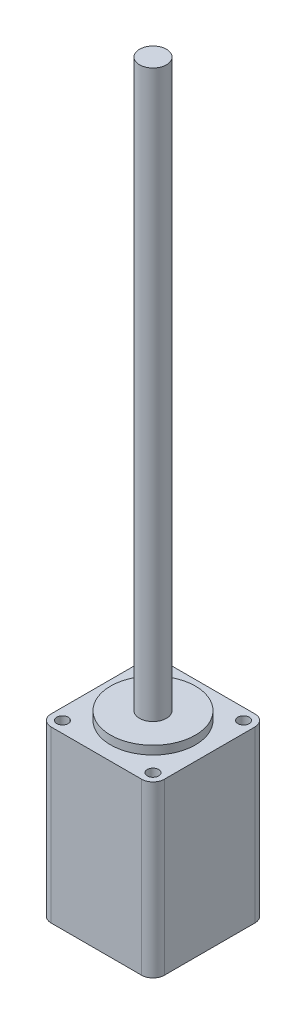
ISO-10303-21;
HEADER;
FILE_DESCRIPTION(('STEP AP214'),'2;1');
FILE_NAME('part.step','',(''),(''),'','','');
FILE_SCHEMA(('AUTOMOTIVE_DESIGN { 1 0 10303 214 1 1 1 1 }'));
ENDSEC;
DATA;
#1=APPLICATION_CONTEXT('core data for automotive mechanical design processes');
#2=APPLICATION_PROTOCOL_DEFINITION('international standard','automotive_design',2000,#1);
#3=PRODUCT_CONTEXT('',#1,'mechanical');
#4=PRODUCT('Part','Part','',(#3));
#5=PRODUCT_RELATED_PRODUCT_CATEGORY('part','',(#4));
#6=PRODUCT_DEFINITION_FORMATION('','',#4);
#7=PRODUCT_DEFINITION_CONTEXT('part definition',#1,'design');
#8=PRODUCT_DEFINITION('design','',#6,#7);
#9=PRODUCT_DEFINITION_SHAPE('','',#8);
#10=(LENGTH_UNIT() NAMED_UNIT(*) SI_UNIT(.MILLI.,.METRE.));
#11=(NAMED_UNIT(*) PLANE_ANGLE_UNIT() SI_UNIT($,.RADIAN.));
#12=(NAMED_UNIT(*) SI_UNIT($,.STERADIAN.) SOLID_ANGLE_UNIT());
#13=UNCERTAINTY_MEASURE_WITH_UNIT(LENGTH_MEASURE(1.E-05),#10,'distance_accuracy_value','');
#14=(GEOMETRIC_REPRESENTATION_CONTEXT(3) GLOBAL_UNCERTAINTY_ASSIGNED_CONTEXT((#13)) GLOBAL_UNIT_ASSIGNED_CONTEXT((#10,
#11,#12)) REPRESENTATION_CONTEXT('',''));
#15=CARTESIAN_POINT('',(0.,0.,0.));
#16=DIRECTION('',(0.,0.,1.));
#17=DIRECTION('',(1.,0.,0.));
#18=AXIS2_PLACEMENT_3D('',#15,#16,#17);
#19=CARTESIAN_POINT('',(10.,30.,10.));
#20=DIRECTION('',(-1.,0.,0.));
#21=DIRECTION('',(0.,0.,1.));
#22=AXIS2_PLACEMENT_3D('',#19,#20,#21);
#23=PLANE('',#22);
#24=DIRECTION('',(0.,0.,-1.));
#25=VECTOR('',#24,1.);
#26=CARTESIAN_POINT('',(10.,0.,10.));
#27=LINE('',#26,#25);
#28=CARTESIAN_POINT('',(10.,0.,8.));
#29=VERTEX_POINT('',#28);
#30=CARTESIAN_POINT('',(10.,0.,-8.));
#31=VERTEX_POINT('',#30);
#32=EDGE_CURVE('E130',#29,#31,#27,.T.);
#33=ORIENTED_EDGE('',*,*,#32,.T.);
#34=DIRECTION('',(0.,-1.,0.));
#35=VECTOR('',#34,1.);
#36=CARTESIAN_POINT('',(10.,30.,-8.));
#37=LINE('',#36,#35);
#38=CARTESIAN_POINT('',(10.,30.,-8.));
#39=VERTEX_POINT('',#38);
#40=EDGE_CURVE('E41',#31,#39,#37,.F.);
#41=ORIENTED_EDGE('',*,*,#40,.T.);
#42=DIRECTION('',(0.,0.,-1.));
#43=VECTOR('',#42,1.);
#44=CARTESIAN_POINT('',(10.,30.,10.));
#45=LINE('',#44,#43);
#46=CARTESIAN_POINT('',(10.,30.,8.));
#47=VERTEX_POINT('',#46);
#48=EDGE_CURVE('E128',#47,#39,#45,.T.);
#49=ORIENTED_EDGE('',*,*,#48,.F.);
#50=DIRECTION('',(0.,-1.,0.));
#51=VECTOR('',#50,1.);
#52=CARTESIAN_POINT('',(10.,30.,8.));
#53=LINE('',#52,#51);
#54=EDGE_CURVE('E154',#47,#29,#53,.T.);
#55=ORIENTED_EDGE('',*,*,#54,.T.);
#56=EDGE_LOOP('',(#33,#41,#49,#55));
#57=FACE_BOUND('',#56,.T.);
#58=ADVANCED_FACE('F33',(#57),#23,.F.);
#59=CARTESIAN_POINT('',(-10.,30.,-10.));
#60=DIRECTION('',(0.,0.,1.));
#61=DIRECTION('',(1.,0.,0.));
#62=AXIS2_PLACEMENT_3D('',#59,#60,#61);
#63=PLANE('',#62);
#64=DIRECTION('',(-1.,0.,0.));
#65=VECTOR('',#64,1.);
#66=CARTESIAN_POINT('',(-10.,0.,-10.));
#67=LINE('',#66,#65);
#68=CARTESIAN_POINT('',(8.,0.,-10.));
#69=VERTEX_POINT('',#68);
#70=CARTESIAN_POINT('',(-8.,0.,-10.));
#71=VERTEX_POINT('',#70);
#72=EDGE_CURVE('E126',#69,#71,#67,.T.);
#73=ORIENTED_EDGE('',*,*,#72,.T.);
#74=DIRECTION('',(0.,-1.,0.));
#75=VECTOR('',#74,1.);
#76=CARTESIAN_POINT('',(-8.,30.,-10.));
#77=LINE('',#76,#75);
#78=CARTESIAN_POINT('',(-8.,30.,-10.));
#79=VERTEX_POINT('',#78);
#80=EDGE_CURVE('E105',#71,#79,#77,.F.);
#81=ORIENTED_EDGE('',*,*,#80,.T.);
#82=DIRECTION('',(-1.,0.,0.));
#83=VECTOR('',#82,1.);
#84=CARTESIAN_POINT('',(-10.,30.,-10.));
#85=LINE('',#84,#83);
#86=CARTESIAN_POINT('',(8.,30.,-10.));
#87=VERTEX_POINT('',#86);
#88=EDGE_CURVE('E169',#87,#79,#85,.T.);
#89=ORIENTED_EDGE('',*,*,#88,.F.);
#90=DIRECTION('',(0.,-1.,0.));
#91=VECTOR('',#90,1.);
#92=CARTESIAN_POINT('',(8.,30.,-10.));
#93=LINE('',#92,#91);
#94=EDGE_CURVE('E110',#87,#69,#93,.T.);
#95=ORIENTED_EDGE('',*,*,#94,.T.);
#96=EDGE_LOOP('',(#73,#81,#89,#95));
#97=FACE_BOUND('',#96,.T.);
#98=ADVANCED_FACE('F174',(#97),#63,.F.);
#99=CARTESIAN_POINT('',(-10.,30.,10.));
#100=DIRECTION('',(1.,0.,0.));
#101=DIRECTION('',(0.,0.,-1.));
#102=AXIS2_PLACEMENT_3D('',#99,#100,#101);
#103=PLANE('',#102);
#104=DIRECTION('',(0.,0.,1.));
#105=VECTOR('',#104,1.);
#106=CARTESIAN_POINT('',(-10.,30.,10.));
#107=LINE('',#106,#105);
#108=CARTESIAN_POINT('',(-10.,30.,-8.));
#109=VERTEX_POINT('',#108);
#110=CARTESIAN_POINT('',(-10.,30.,8.));
#111=VERTEX_POINT('',#110);
#112=EDGE_CURVE('E119',#109,#111,#107,.T.);
#113=ORIENTED_EDGE('',*,*,#112,.F.);
#114=DIRECTION('',(0.,-1.,0.));
#115=VECTOR('',#114,1.);
#116=CARTESIAN_POINT('',(-10.,30.,-8.));
#117=LINE('',#116,#115);
#118=CARTESIAN_POINT('',(-10.,0.,-8.));
#119=VERTEX_POINT('',#118);
#120=EDGE_CURVE('E104',#109,#119,#117,.T.);
#121=ORIENTED_EDGE('',*,*,#120,.T.);
#122=DIRECTION('',(0.,0.,1.));
#123=VECTOR('',#122,1.);
#124=CARTESIAN_POINT('',(-10.,0.,10.));
#125=LINE('',#124,#123);
#126=CARTESIAN_POINT('',(-10.,0.,8.));
#127=VERTEX_POINT('',#126);
#128=EDGE_CURVE('E117',#119,#127,#125,.T.);
#129=ORIENTED_EDGE('',*,*,#128,.T.);
#130=DIRECTION('',(0.,-1.,0.));
#131=VECTOR('',#130,1.);
#132=CARTESIAN_POINT('',(-10.,30.,8.));
#133=LINE('',#132,#131);
#134=EDGE_CURVE('E121',#127,#111,#133,.F.);
#135=ORIENTED_EDGE('',*,*,#134,.T.);
#136=EDGE_LOOP('',(#113,#121,#129,#135));
#137=FACE_BOUND('',#136,.T.);
#138=ADVANCED_FACE('F116',(#137),#103,.F.);
#139=CARTESIAN_POINT('',(-10.,30.,10.));
#140=DIRECTION('',(0.,0.,-1.));
#141=DIRECTION('',(-1.,0.,0.));
#142=AXIS2_PLACEMENT_3D('',#139,#140,#141);
#143=PLANE('',#142);
#144=DIRECTION('',(1.,0.,0.));
#145=VECTOR('',#144,1.);
#146=CARTESIAN_POINT('',(-10.,30.,10.));
#147=LINE('',#146,#145);
#148=CARTESIAN_POINT('',(-8.,30.,10.));
#149=VERTEX_POINT('',#148);
#150=CARTESIAN_POINT('',(8.,30.,10.));
#151=VERTEX_POINT('',#150);
#152=EDGE_CURVE('E134',#149,#151,#147,.T.);
#153=ORIENTED_EDGE('',*,*,#152,.F.);
#154=DIRECTION('',(0.,-1.,0.));
#155=VECTOR('',#154,1.);
#156=CARTESIAN_POINT('',(-8.,30.,10.));
#157=LINE('',#156,#155);
#158=CARTESIAN_POINT('',(-8.,0.,10.));
#159=VERTEX_POINT('',#158);
#160=EDGE_CURVE('E151',#149,#159,#157,.T.);
#161=ORIENTED_EDGE('',*,*,#160,.T.);
#162=DIRECTION('',(1.,0.,0.));
#163=VECTOR('',#162,1.);
#164=CARTESIAN_POINT('',(-10.,0.,10.));
#165=LINE('',#164,#163);
#166=CARTESIAN_POINT('',(8.,0.,10.));
#167=VERTEX_POINT('',#166);
#168=EDGE_CURVE('E125',#159,#167,#165,.T.);
#169=ORIENTED_EDGE('',*,*,#168,.T.);
#170=DIRECTION('',(0.,-1.,0.));
#171=VECTOR('',#170,1.);
#172=CARTESIAN_POINT('',(8.,30.,10.));
#173=LINE('',#172,#171);
#174=EDGE_CURVE('E48',#167,#151,#173,.F.);
#175=ORIENTED_EDGE('',*,*,#174,.T.);
#176=EDGE_LOOP('',(#153,#161,#169,#175));
#177=FACE_BOUND('',#176,.T.);
#178=ADVANCED_FACE('F236',(#177),#143,.F.);
#179=CARTESIAN_POINT('',(0.,30.,0.));
#180=DIRECTION('',(0.,-1.,0.));
#181=DIRECTION('',(0.,0.,-1.));
#182=AXIS2_PLACEMENT_3D('',#179,#180,#181);
#183=PLANE('',#182);
#184=CARTESIAN_POINT('',(0.,30.,0.));
#185=DIRECTION('',(0.,-1.,0.));
#186=DIRECTION('',(0.,0.,-1.));
#187=AXIS2_PLACEMENT_3D('',#184,#185,#186);
#188=CIRCLE('',#187,7.5);
#189=CARTESIAN_POINT('',(0.,30.,-7.5));
#190=VERTEX_POINT('',#189);
#191=EDGE_CURVE('E11',#190,#190,#188,.F.);
#192=ORIENTED_EDGE('',*,*,#191,.F.);
#193=EDGE_LOOP('',(#192));
#194=FACE_BOUND('',#193,.T.);
#195=CARTESIAN_POINT('',(-8.,30.,8.));
#196=DIRECTION('',(0.,1.,0.));
#197=DIRECTION('',(0.,0.,1.));
#198=AXIS2_PLACEMENT_3D('',#195,#196,#197);
#199=CIRCLE('',#198,1.);
#200=CARTESIAN_POINT('',(-8.,30.,9.));
#201=VERTEX_POINT('',#200);
#202=EDGE_CURVE('E198',#201,#201,#199,.T.);
#203=ORIENTED_EDGE('',*,*,#202,.F.);
#204=EDGE_LOOP('',(#203));
#205=FACE_BOUND('',#204,.T.);
#206=CARTESIAN_POINT('',(8.,30.,8.));
#207=DIRECTION('',(0.,1.,0.));
#208=DIRECTION('',(0.,0.,1.));
#209=AXIS2_PLACEMENT_3D('',#206,#207,#208);
#210=CIRCLE('',#209,1.);
#211=CARTESIAN_POINT('',(8.,30.,9.));
#212=VERTEX_POINT('',#211);
#213=EDGE_CURVE('E192',#212,#212,#210,.T.);
#214=ORIENTED_EDGE('',*,*,#213,.F.);
#215=EDGE_LOOP('',(#214));
#216=FACE_BOUND('',#215,.T.);
#217=CARTESIAN_POINT('',(8.,30.,-8.));
#218=DIRECTION('',(0.,1.,0.));
#219=DIRECTION('',(0.,0.,1.));
#220=AXIS2_PLACEMENT_3D('',#217,#218,#219);
#221=CIRCLE('',#220,1.);
#222=CARTESIAN_POINT('',(8.,30.,-7.));
#223=VERTEX_POINT('',#222);
#224=EDGE_CURVE('E186',#223,#223,#221,.T.);
#225=ORIENTED_EDGE('',*,*,#224,.F.);
#226=EDGE_LOOP('',(#225));
#227=FACE_BOUND('',#226,.T.);
#228=CARTESIAN_POINT('',(-8.,30.,-8.));
#229=DIRECTION('',(0.,1.,0.));
#230=DIRECTION('',(0.,0.,1.));
#231=AXIS2_PLACEMENT_3D('',#228,#229,#230);
#232=CIRCLE('',#231,1.);
#233=CARTESIAN_POINT('',(-8.,30.,-7.));
#234=VERTEX_POINT('',#233);
#235=EDGE_CURVE('E177',#234,#234,#232,.T.);
#236=ORIENTED_EDGE('',*,*,#235,.F.);
#237=EDGE_LOOP('',(#236));
#238=FACE_BOUND('',#237,.T.);
#239=ORIENTED_EDGE('',*,*,#88,.T.);
#240=CARTESIAN_POINT('',(-8.,30.,-8.));
#241=DIRECTION('',(0.,-1.,0.));
#242=DIRECTION('',(0.,0.,-1.));
#243=AXIS2_PLACEMENT_3D('',#240,#241,#242);
#244=CIRCLE('',#243,2.);
#245=EDGE_CURVE('E148',#79,#109,#244,.F.);
#246=ORIENTED_EDGE('',*,*,#245,.T.);
#247=ORIENTED_EDGE('',*,*,#112,.T.);
#248=CARTESIAN_POINT('',(-8.,30.,8.));
#249=DIRECTION('',(0.,-1.,0.));
#250=DIRECTION('',(0.,0.,-1.));
#251=AXIS2_PLACEMENT_3D('',#248,#249,#250);
#252=CIRCLE('',#251,2.);
#253=EDGE_CURVE('E55',#111,#149,#252,.F.);
#254=ORIENTED_EDGE('',*,*,#253,.T.);
#255=ORIENTED_EDGE('',*,*,#152,.T.);
#256=CARTESIAN_POINT('',(8.,30.,8.));
#257=DIRECTION('',(0.,-1.,0.));
#258=DIRECTION('',(0.,0.,-1.));
#259=AXIS2_PLACEMENT_3D('',#256,#257,#258);
#260=CIRCLE('',#259,2.);
#261=EDGE_CURVE('E143',#151,#47,#260,.F.);
#262=ORIENTED_EDGE('',*,*,#261,.T.);
#263=ORIENTED_EDGE('',*,*,#48,.T.);
#264=CARTESIAN_POINT('',(8.,30.,-8.));
#265=DIRECTION('',(0.,-1.,0.));
#266=DIRECTION('',(0.,0.,-1.));
#267=AXIS2_PLACEMENT_3D('',#264,#265,#266);
#268=CIRCLE('',#267,2.);
#269=EDGE_CURVE('E145',#39,#87,#268,.F.);
#270=ORIENTED_EDGE('',*,*,#269,.T.);
#271=EDGE_LOOP('',(#239,#246,#247,#254,#255,#262,#263,#270));
#272=FACE_BOUND('',#271,.T.);
#273=ADVANCED_FACE('F166',(#194,#205,#216,#227,#238,#272),#183,.F.);
#274=CARTESIAN_POINT('',(0.,0.,0.));
#275=DIRECTION('',(0.,-1.,0.));
#276=DIRECTION('',(0.,0.,-1.));
#277=AXIS2_PLACEMENT_3D('',#274,#275,#276);
#278=PLANE('',#277);
#279=ORIENTED_EDGE('',*,*,#128,.F.);
#280=CARTESIAN_POINT('',(-8.,0.,-8.));
#281=DIRECTION('',(0.,-1.,0.));
#282=DIRECTION('',(0.,0.,-1.));
#283=AXIS2_PLACEMENT_3D('',#280,#281,#282);
#284=CIRCLE('',#283,2.);
#285=EDGE_CURVE('E100',#119,#71,#284,.T.);
#286=ORIENTED_EDGE('',*,*,#285,.T.);
#287=ORIENTED_EDGE('',*,*,#72,.F.);
#288=CARTESIAN_POINT('',(8.,0.,-8.));
#289=DIRECTION('',(0.,-1.,0.));
#290=DIRECTION('',(0.,0.,-1.));
#291=AXIS2_PLACEMENT_3D('',#288,#289,#290);
#292=CIRCLE('',#291,2.);
#293=EDGE_CURVE('E137',#69,#31,#292,.T.);
#294=ORIENTED_EDGE('',*,*,#293,.T.);
#295=ORIENTED_EDGE('',*,*,#32,.F.);
#296=CARTESIAN_POINT('',(8.,0.,8.));
#297=DIRECTION('',(0.,-1.,0.));
#298=DIRECTION('',(0.,0.,-1.));
#299=AXIS2_PLACEMENT_3D('',#296,#297,#298);
#300=CIRCLE('',#299,2.);
#301=EDGE_CURVE('E120',#29,#167,#300,.T.);
#302=ORIENTED_EDGE('',*,*,#301,.T.);
#303=ORIENTED_EDGE('',*,*,#168,.F.);
#304=CARTESIAN_POINT('',(-8.,0.,8.));
#305=DIRECTION('',(0.,-1.,0.));
#306=DIRECTION('',(0.,0.,-1.));
#307=AXIS2_PLACEMENT_3D('',#304,#305,#306);
#308=CIRCLE('',#307,2.);
#309=EDGE_CURVE('E111',#159,#127,#308,.T.);
#310=ORIENTED_EDGE('',*,*,#309,.T.);
#311=EDGE_LOOP('',(#279,#286,#287,#294,#295,#302,#303,#310));
#312=FACE_BOUND('',#311,.T.);
#313=ADVANCED_FACE('F123',(#312),#278,.T.);
#314=CARTESIAN_POINT('',(-8.,30.,-8.));
#315=DIRECTION('',(0.,-1.,0.));
#316=DIRECTION('',(0.,0.,-1.));
#317=AXIS2_PLACEMENT_3D('',#314,#315,#316);
#318=CYLINDRICAL_SURFACE('',#317,2.);
#319=ORIENTED_EDGE('',*,*,#245,.F.);
#320=ORIENTED_EDGE('',*,*,#80,.F.);
#321=ORIENTED_EDGE('',*,*,#285,.F.);
#322=ORIENTED_EDGE('',*,*,#120,.F.);
#323=EDGE_LOOP('',(#319,#320,#321,#322));
#324=FACE_BOUND('',#323,.T.);
#325=ADVANCED_FACE('F103',(#324),#318,.T.);
#326=CARTESIAN_POINT('',(-8.,30.,8.));
#327=DIRECTION('',(0.,-1.,0.));
#328=DIRECTION('',(0.,0.,-1.));
#329=AXIS2_PLACEMENT_3D('',#326,#327,#328);
#330=CYLINDRICAL_SURFACE('',#329,2.);
#331=ORIENTED_EDGE('',*,*,#253,.F.);
#332=ORIENTED_EDGE('',*,*,#134,.F.);
#333=ORIENTED_EDGE('',*,*,#309,.F.);
#334=ORIENTED_EDGE('',*,*,#160,.F.);
#335=EDGE_LOOP('',(#331,#332,#333,#334));
#336=FACE_BOUND('',#335,.T.);
#337=ADVANCED_FACE('F270',(#336),#330,.T.);
#338=CARTESIAN_POINT('',(8.,30.,-8.));
#339=DIRECTION('',(0.,-1.,0.));
#340=DIRECTION('',(0.,0.,-1.));
#341=AXIS2_PLACEMENT_3D('',#338,#339,#340);
#342=CYLINDRICAL_SURFACE('',#341,2.);
#343=ORIENTED_EDGE('',*,*,#269,.F.);
#344=ORIENTED_EDGE('',*,*,#40,.F.);
#345=ORIENTED_EDGE('',*,*,#293,.F.);
#346=ORIENTED_EDGE('',*,*,#94,.F.);
#347=EDGE_LOOP('',(#343,#344,#345,#346));
#348=FACE_BOUND('',#347,.T.);
#349=ADVANCED_FACE('F172',(#348),#342,.T.);
#350=CARTESIAN_POINT('',(8.,30.,8.));
#351=DIRECTION('',(0.,-1.,0.));
#352=DIRECTION('',(0.,0.,-1.));
#353=AXIS2_PLACEMENT_3D('',#350,#351,#352);
#354=CYLINDRICAL_SURFACE('',#353,2.);
#355=ORIENTED_EDGE('',*,*,#261,.F.);
#356=ORIENTED_EDGE('',*,*,#174,.F.);
#357=ORIENTED_EDGE('',*,*,#301,.F.);
#358=ORIENTED_EDGE('',*,*,#54,.F.);
#359=EDGE_LOOP('',(#355,#356,#357,#358));
#360=FACE_BOUND('',#359,.T.);
#361=ADVANCED_FACE('F35',(#360),#354,.T.);
#362=CARTESIAN_POINT('',(-8.,27.,-8.));
#363=DIRECTION('',(0.,1.,0.));
#364=DIRECTION('',(0.,0.,1.));
#365=AXIS2_PLACEMENT_3D('',#362,#363,#364);
#366=CYLINDRICAL_SURFACE('',#365,1.);
#367=CARTESIAN_POINT('',(-8.,27.,-8.));
#368=DIRECTION('',(0.,1.,0.));
#369=DIRECTION('',(0.,0.,1.));
#370=AXIS2_PLACEMENT_3D('',#367,#368,#369);
#371=CIRCLE('',#370,1.);
#372=CARTESIAN_POINT('',(-8.,27.,-7.));
#373=VERTEX_POINT('',#372);
#374=EDGE_CURVE('E175',#373,#373,#371,.T.);
#375=ORIENTED_EDGE('',*,*,#374,.F.);
#376=EDGE_LOOP('',(#375));
#377=FACE_BOUND('',#376,.T.);
#378=ORIENTED_EDGE('',*,*,#235,.T.);
#379=EDGE_LOOP('',(#378));
#380=FACE_BOUND('',#379,.T.);
#381=ADVANCED_FACE('F246',(#377,#380),#366,.F.);
#382=CARTESIAN_POINT('',(-8.,27.,-8.));
#383=DIRECTION('',(0.,1.,0.));
#384=DIRECTION('',(0.,0.,1.));
#385=AXIS2_PLACEMENT_3D('',#382,#383,#384);
#386=PLANE('',#385);
#387=ORIENTED_EDGE('',*,*,#374,.T.);
#388=EDGE_LOOP('',(#387));
#389=FACE_BOUND('',#388,.T.);
#390=ADVANCED_FACE('F248',(#389),#386,.T.);
#391=CARTESIAN_POINT('',(8.,27.,-8.));
#392=DIRECTION('',(0.,1.,0.));
#393=DIRECTION('',(0.,0.,1.));
#394=AXIS2_PLACEMENT_3D('',#391,#392,#393);
#395=CYLINDRICAL_SURFACE('',#394,1.);
#396=CARTESIAN_POINT('',(8.,27.,-8.));
#397=DIRECTION('',(0.,1.,0.));
#398=DIRECTION('',(0.,0.,1.));
#399=AXIS2_PLACEMENT_3D('',#396,#397,#398);
#400=CIRCLE('',#399,1.);
#401=CARTESIAN_POINT('',(8.,27.,-7.));
#402=VERTEX_POINT('',#401);
#403=EDGE_CURVE('E184',#402,#402,#400,.T.);
#404=ORIENTED_EDGE('',*,*,#403,.F.);
#405=EDGE_LOOP('',(#404));
#406=FACE_BOUND('',#405,.T.);
#407=ORIENTED_EDGE('',*,*,#224,.T.);
#408=EDGE_LOOP('',(#407));
#409=FACE_BOUND('',#408,.T.);
#410=ADVANCED_FACE('F255',(#406,#409),#395,.F.);
#411=CARTESIAN_POINT('',(8.,27.,-8.));
#412=DIRECTION('',(0.,1.,0.));
#413=DIRECTION('',(0.,0.,1.));
#414=AXIS2_PLACEMENT_3D('',#411,#412,#413);
#415=PLANE('',#414);
#416=ORIENTED_EDGE('',*,*,#403,.T.);
#417=EDGE_LOOP('',(#416));
#418=FACE_BOUND('',#417,.T.);
#419=ADVANCED_FACE('F301',(#418),#415,.T.);
#420=CARTESIAN_POINT('',(8.,27.,8.));
#421=DIRECTION('',(0.,1.,0.));
#422=DIRECTION('',(0.,0.,1.));
#423=AXIS2_PLACEMENT_3D('',#420,#421,#422);
#424=CYLINDRICAL_SURFACE('',#423,1.);
#425=CARTESIAN_POINT('',(8.,27.,8.));
#426=DIRECTION('',(0.,1.,0.));
#427=DIRECTION('',(0.,0.,1.));
#428=AXIS2_PLACEMENT_3D('',#425,#426,#427);
#429=CIRCLE('',#428,1.);
#430=CARTESIAN_POINT('',(8.,27.,9.));
#431=VERTEX_POINT('',#430);
#432=EDGE_CURVE('E189',#431,#431,#429,.T.);
#433=ORIENTED_EDGE('',*,*,#432,.F.);
#434=EDGE_LOOP('',(#433));
#435=FACE_BOUND('',#434,.T.);
#436=ORIENTED_EDGE('',*,*,#213,.T.);
#437=EDGE_LOOP('',(#436));
#438=FACE_BOUND('',#437,.T.);
#439=ADVANCED_FACE('F311',(#435,#438),#424,.F.);
#440=CARTESIAN_POINT('',(8.,27.,8.));
#441=DIRECTION('',(0.,1.,0.));
#442=DIRECTION('',(0.,0.,1.));
#443=AXIS2_PLACEMENT_3D('',#440,#441,#442);
#444=PLANE('',#443);
#445=ORIENTED_EDGE('',*,*,#432,.T.);
#446=EDGE_LOOP('',(#445));
#447=FACE_BOUND('',#446,.T.);
#448=ADVANCED_FACE('F321',(#447),#444,.T.);
#449=CARTESIAN_POINT('',(-8.,27.,8.));
#450=DIRECTION('',(0.,1.,0.));
#451=DIRECTION('',(0.,0.,1.));
#452=AXIS2_PLACEMENT_3D('',#449,#450,#451);
#453=CYLINDRICAL_SURFACE('',#452,1.);
#454=CARTESIAN_POINT('',(-8.,27.,8.));
#455=DIRECTION('',(0.,1.,0.));
#456=DIRECTION('',(0.,0.,1.));
#457=AXIS2_PLACEMENT_3D('',#454,#455,#456);
#458=CIRCLE('',#457,1.);
#459=CARTESIAN_POINT('',(-8.,27.,9.));
#460=VERTEX_POINT('',#459);
#461=EDGE_CURVE('E195',#460,#460,#458,.T.);
#462=ORIENTED_EDGE('',*,*,#461,.F.);
#463=EDGE_LOOP('',(#462));
#464=FACE_BOUND('',#463,.T.);
#465=ORIENTED_EDGE('',*,*,#202,.T.);
#466=EDGE_LOOP('',(#465));
#467=FACE_BOUND('',#466,.T.);
#468=ADVANCED_FACE('F331',(#464,#467),#453,.F.);
#469=CARTESIAN_POINT('',(-8.,27.,8.));
#470=DIRECTION('',(0.,1.,0.));
#471=DIRECTION('',(0.,0.,1.));
#472=AXIS2_PLACEMENT_3D('',#469,#470,#471);
#473=PLANE('',#472);
#474=ORIENTED_EDGE('',*,*,#461,.T.);
#475=EDGE_LOOP('',(#474));
#476=FACE_BOUND('',#475,.T.);
#477=ADVANCED_FACE('F230',(#476),#473,.T.);
#478=CARTESIAN_POINT('',(0.,31.5,0.));
#479=DIRECTION('',(0.,-1.,0.));
#480=DIRECTION('',(0.,0.,-1.));
#481=AXIS2_PLACEMENT_3D('',#478,#479,#480);
#482=CYLINDRICAL_SURFACE('',#481,7.5);
#483=CARTESIAN_POINT('',(0.,31.5,0.));
#484=DIRECTION('',(0.,1.,0.));
#485=DIRECTION('',(0.,0.,1.));
#486=AXIS2_PLACEMENT_3D('',#483,#484,#485);
#487=CIRCLE('',#486,7.5);
#488=CARTESIAN_POINT('',(0.,31.5,7.5));
#489=VERTEX_POINT('',#488);
#490=EDGE_CURVE('E201',#489,#489,#487,.T.);
#491=ORIENTED_EDGE('',*,*,#490,.F.);
#492=EDGE_LOOP('',(#491));
#493=FACE_BOUND('',#492,.T.);
#494=ORIENTED_EDGE('',*,*,#191,.T.);
#495=EDGE_LOOP('',(#494));
#496=FACE_BOUND('',#495,.T.);
#497=ADVANCED_FACE('F224',(#493,#496),#482,.T.);
#498=CARTESIAN_POINT('',(0.,31.5,0.));
#499=DIRECTION('',(0.,1.,0.));
#500=DIRECTION('',(0.,0.,1.));
#501=AXIS2_PLACEMENT_3D('',#498,#499,#500);
#502=PLANE('',#501);
#503=CARTESIAN_POINT('',(0.,31.5,0.));
#504=DIRECTION('',(0.,1.,0.));
#505=DIRECTION('',(0.,0.,1.));
#506=AXIS2_PLACEMENT_3D('',#503,#504,#505);
#507=CIRCLE('',#506,2.38);
#508=CARTESIAN_POINT('',(0.,31.5,2.38));
#509=VERTEX_POINT('',#508);
#510=EDGE_CURVE('E207',#509,#509,#507,.T.);
#511=ORIENTED_EDGE('',*,*,#510,.F.);
#512=EDGE_LOOP('',(#511));
#513=FACE_BOUND('',#512,.T.);
#514=ORIENTED_EDGE('',*,*,#490,.T.);
#515=EDGE_LOOP('',(#514));
#516=FACE_BOUND('',#515,.T.);
#517=ADVANCED_FACE('F218',(#513,#516),#502,.T.);
#518=CARTESIAN_POINT('',(0.,131.5,0.));
#519=DIRECTION('',(0.,-1.,0.));
#520=DIRECTION('',(0.,0.,-1.));
#521=AXIS2_PLACEMENT_3D('',#518,#519,#520);
#522=CYLINDRICAL_SURFACE('',#521,2.38);
#523=CARTESIAN_POINT('',(0.,131.5,0.));
#524=DIRECTION('',(0.,1.,0.));
#525=DIRECTION('',(0.,0.,1.));
#526=AXIS2_PLACEMENT_3D('',#523,#524,#525);
#527=CIRCLE('',#526,2.38);
#528=CARTESIAN_POINT('',(0.,131.5,2.38));
#529=VERTEX_POINT('',#528);
#530=EDGE_CURVE('E206',#529,#529,#527,.T.);
#531=ORIENTED_EDGE('',*,*,#530,.F.);
#532=EDGE_LOOP('',(#531));
#533=FACE_BOUND('',#532,.T.);
#534=ORIENTED_EDGE('',*,*,#510,.T.);
#535=EDGE_LOOP('',(#534));
#536=FACE_BOUND('',#535,.T.);
#537=ADVANCED_FACE('F215',(#533,#536),#522,.T.);
#538=CARTESIAN_POINT('',(0.,131.5,0.));
#539=DIRECTION('',(0.,1.,0.));
#540=DIRECTION('',(0.,0.,1.));
#541=AXIS2_PLACEMENT_3D('',#538,#539,#540);
#542=PLANE('',#541);
#543=ORIENTED_EDGE('',*,*,#530,.T.);
#544=EDGE_LOOP('',(#543));
#545=FACE_BOUND('',#544,.T.);
#546=ADVANCED_FACE('F213',(#545),#542,.T.);
#547=CLOSED_SHELL('',(#58,#98,#138,#178,#273,#313,#325,#337,#349,#361,#381,#390,#410,#419,#439,
#448,#468,#477,#497,#517,#537,#546));
#548=MANIFOLD_SOLID_BREP('B2',#547);
#549=ADVANCED_BREP_SHAPE_REPRESENTATION('',(#18,#548),#14);
#550=SHAPE_DEFINITION_REPRESENTATION(#9,#549);
ENDSEC;
END-ISO-10303-21;
